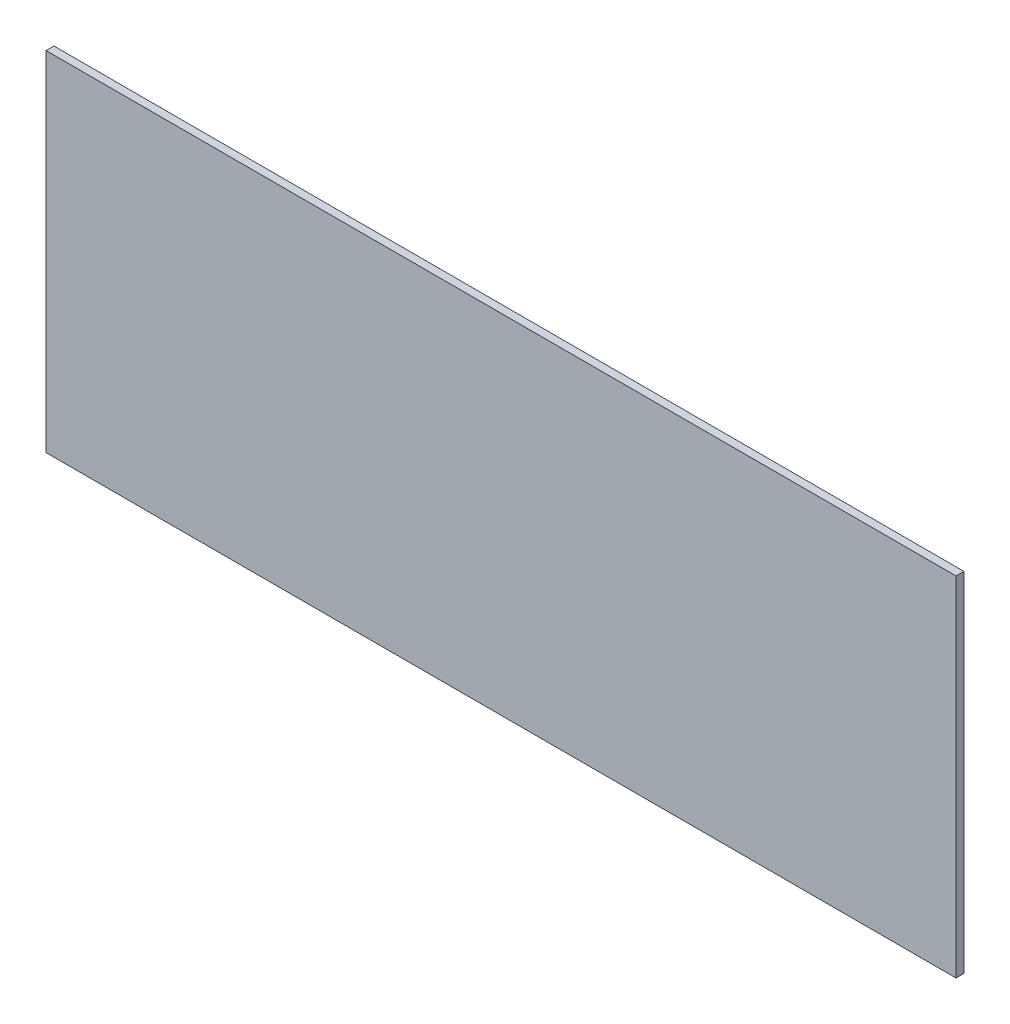
ISO-10303-21;
HEADER;
FILE_DESCRIPTION(('STEP AP214'),'2;1');
FILE_NAME('part.step','',(''),(''),'','','');
FILE_SCHEMA(('AUTOMOTIVE_DESIGN { 1 0 10303 214 1 1 1 1 }'));
ENDSEC;
DATA;
#1=APPLICATION_CONTEXT('core data for automotive mechanical design processes');
#2=APPLICATION_PROTOCOL_DEFINITION('international standard','automotive_design',2000,#1);
#3=PRODUCT_CONTEXT('',#1,'mechanical');
#4=PRODUCT('Part','Part','',(#3));
#5=PRODUCT_RELATED_PRODUCT_CATEGORY('part','',(#4));
#6=PRODUCT_DEFINITION_FORMATION('','',#4);
#7=PRODUCT_DEFINITION_CONTEXT('part definition',#1,'design');
#8=PRODUCT_DEFINITION('design','',#6,#7);
#9=PRODUCT_DEFINITION_SHAPE('','',#8);
#10=(LENGTH_UNIT() NAMED_UNIT(*) SI_UNIT(.MILLI.,.METRE.));
#11=(NAMED_UNIT(*) PLANE_ANGLE_UNIT() SI_UNIT($,.RADIAN.));
#12=(NAMED_UNIT(*) SI_UNIT($,.STERADIAN.) SOLID_ANGLE_UNIT());
#13=UNCERTAINTY_MEASURE_WITH_UNIT(LENGTH_MEASURE(1.E-05),#10,'distance_accuracy_value','');
#14=(GEOMETRIC_REPRESENTATION_CONTEXT(3) GLOBAL_UNCERTAINTY_ASSIGNED_CONTEXT((#13)) GLOBAL_UNIT_ASSIGNED_CONTEXT((#10,
#11,#12)) REPRESENTATION_CONTEXT('',''));
#15=CARTESIAN_POINT('',(0.,0.,0.));
#16=DIRECTION('',(0.,0.,1.));
#17=DIRECTION('',(1.,0.,0.));
#18=AXIS2_PLACEMENT_3D('',#15,#16,#17);
#19=CARTESIAN_POINT('',(575.,220.,10.));
#20=DIRECTION('',(-1.,0.,0.));
#21=DIRECTION('',(0.,-1.,0.));
#22=AXIS2_PLACEMENT_3D('',#19,#20,#21);
#23=PLANE('',#22);
#24=DIRECTION('',(0.,1.,0.));
#25=VECTOR('',#24,1.);
#26=CARTESIAN_POINT('',(575.,220.,0.));
#27=LINE('',#26,#25);
#28=CARTESIAN_POINT('',(575.,-220.,0.));
#29=VERTEX_POINT('',#28);
#30=CARTESIAN_POINT('',(575.,220.,0.));
#31=VERTEX_POINT('',#30);
#32=EDGE_CURVE('E96',#29,#31,#27,.T.);
#33=ORIENTED_EDGE('',*,*,#32,.T.);
#34=DIRECTION('',(0.,0.,-1.));
#35=VECTOR('',#34,1.);
#36=CARTESIAN_POINT('',(575.,220.,10.));
#37=LINE('',#36,#35);
#38=CARTESIAN_POINT('',(575.,220.,10.));
#39=VERTEX_POINT('',#38);
#40=EDGE_CURVE('E11',#39,#31,#37,.T.);
#41=ORIENTED_EDGE('',*,*,#40,.F.);
#42=DIRECTION('',(0.,1.,0.));
#43=VECTOR('',#42,1.);
#44=CARTESIAN_POINT('',(575.,220.,10.));
#45=LINE('',#44,#43);
#46=CARTESIAN_POINT('',(575.,-220.,10.));
#47=VERTEX_POINT('',#46);
#48=EDGE_CURVE('E84',#47,#39,#45,.T.);
#49=ORIENTED_EDGE('',*,*,#48,.F.);
#50=DIRECTION('',(0.,0.,-1.));
#51=VECTOR('',#50,1.);
#52=CARTESIAN_POINT('',(575.,-220.,10.));
#53=LINE('',#52,#51);
#54=EDGE_CURVE('E92',#47,#29,#53,.T.);
#55=ORIENTED_EDGE('',*,*,#54,.T.);
#56=EDGE_LOOP('',(#33,#41,#49,#55));
#57=FACE_BOUND('',#56,.T.);
#58=ADVANCED_FACE('F33',(#57),#23,.F.);
#59=CARTESIAN_POINT('',(-575.,220.,10.));
#60=DIRECTION('',(0.,-1.,0.));
#61=DIRECTION('',(0.,0.,-1.));
#62=AXIS2_PLACEMENT_3D('',#59,#60,#61);
#63=PLANE('',#62);
#64=DIRECTION('',(-1.,0.,0.));
#65=VECTOR('',#64,1.);
#66=CARTESIAN_POINT('',(-575.,220.,0.));
#67=LINE('',#66,#65);
#68=CARTESIAN_POINT('',(-575.,220.,0.));
#69=VERTEX_POINT('',#68);
#70=EDGE_CURVE('E88',#31,#69,#67,.T.);
#71=ORIENTED_EDGE('',*,*,#70,.T.);
#72=DIRECTION('',(0.,0.,-1.));
#73=VECTOR('',#72,1.);
#74=CARTESIAN_POINT('',(-575.,220.,10.));
#75=LINE('',#74,#73);
#76=CARTESIAN_POINT('',(-575.,220.,10.));
#77=VERTEX_POINT('',#76);
#78=EDGE_CURVE('E41',#77,#69,#75,.T.);
#79=ORIENTED_EDGE('',*,*,#78,.F.);
#80=DIRECTION('',(-1.,0.,0.));
#81=VECTOR('',#80,1.);
#82=CARTESIAN_POINT('',(-575.,220.,10.));
#83=LINE('',#82,#81);
#84=EDGE_CURVE('E79',#39,#77,#83,.T.);
#85=ORIENTED_EDGE('',*,*,#84,.F.);
#86=ORIENTED_EDGE('',*,*,#40,.T.);
#87=EDGE_LOOP('',(#71,#79,#85,#86));
#88=FACE_BOUND('',#87,.T.);
#89=ADVANCED_FACE('F87',(#88),#63,.F.);
#90=CARTESIAN_POINT('',(-575.,220.,10.));
#91=DIRECTION('',(1.,0.,0.));
#92=DIRECTION('',(0.,1.,0.));
#93=AXIS2_PLACEMENT_3D('',#90,#91,#92);
#94=PLANE('',#93);
#95=DIRECTION('',(0.,-1.,0.));
#96=VECTOR('',#95,1.);
#97=CARTESIAN_POINT('',(-575.,220.,0.));
#98=LINE('',#97,#96);
#99=CARTESIAN_POINT('',(-575.,-220.,0.));
#100=VERTEX_POINT('',#99);
#101=EDGE_CURVE('E66',#69,#100,#98,.T.);
#102=ORIENTED_EDGE('',*,*,#101,.T.);
#103=DIRECTION('',(0.,0.,-1.));
#104=VECTOR('',#103,1.);
#105=CARTESIAN_POINT('',(-575.,-220.,10.));
#106=LINE('',#105,#104);
#107=CARTESIAN_POINT('',(-575.,-220.,10.));
#108=VERTEX_POINT('',#107);
#109=EDGE_CURVE('E89',#108,#100,#106,.T.);
#110=ORIENTED_EDGE('',*,*,#109,.F.);
#111=DIRECTION('',(0.,-1.,0.));
#112=VECTOR('',#111,1.);
#113=CARTESIAN_POINT('',(-575.,220.,10.));
#114=LINE('',#113,#112);
#115=EDGE_CURVE('E82',#77,#108,#114,.T.);
#116=ORIENTED_EDGE('',*,*,#115,.F.);
#117=ORIENTED_EDGE('',*,*,#78,.T.);
#118=EDGE_LOOP('',(#102,#110,#116,#117));
#119=FACE_BOUND('',#118,.T.);
#120=ADVANCED_FACE('F90',(#119),#94,.F.);
#121=CARTESIAN_POINT('',(-575.,-220.,10.));
#122=DIRECTION('',(0.,1.,0.));
#123=DIRECTION('',(-1.,0.,0.));
#124=AXIS2_PLACEMENT_3D('',#121,#122,#123);
#125=PLANE('',#124);
#126=DIRECTION('',(1.,0.,0.));
#127=VECTOR('',#126,1.);
#128=CARTESIAN_POINT('',(-575.,-220.,0.));
#129=LINE('',#128,#127);
#130=EDGE_CURVE('E72',#100,#29,#129,.T.);
#131=ORIENTED_EDGE('',*,*,#130,.T.);
#132=ORIENTED_EDGE('',*,*,#54,.F.);
#133=DIRECTION('',(1.,0.,0.));
#134=VECTOR('',#133,1.);
#135=CARTESIAN_POINT('',(-575.,-220.,10.));
#136=LINE('',#135,#134);
#137=EDGE_CURVE('E49',#108,#47,#136,.T.);
#138=ORIENTED_EDGE('',*,*,#137,.F.);
#139=ORIENTED_EDGE('',*,*,#109,.T.);
#140=EDGE_LOOP('',(#131,#132,#138,#139));
#141=FACE_BOUND('',#140,.T.);
#142=ADVANCED_FACE('F103',(#141),#125,.F.);
#143=CARTESIAN_POINT('',(0.,0.,10.));
#144=DIRECTION('',(0.,0.,1.));
#145=DIRECTION('',(1.,0.,0.));
#146=AXIS2_PLACEMENT_3D('',#143,#144,#145);
#147=PLANE('',#146);
#148=ORIENTED_EDGE('',*,*,#48,.T.);
#149=ORIENTED_EDGE('',*,*,#84,.T.);
#150=ORIENTED_EDGE('',*,*,#115,.T.);
#151=ORIENTED_EDGE('',*,*,#137,.T.);
#152=EDGE_LOOP('',(#148,#149,#150,#151));
#153=FACE_BOUND('',#152,.T.);
#154=ADVANCED_FACE('F80',(#153),#147,.T.);
#155=CARTESIAN_POINT('',(0.,0.,0.));
#156=DIRECTION('',(0.,0.,1.));
#157=DIRECTION('',(1.,0.,0.));
#158=AXIS2_PLACEMENT_3D('',#155,#156,#157);
#159=PLANE('',#158);
#160=ORIENTED_EDGE('',*,*,#32,.F.);
#161=ORIENTED_EDGE('',*,*,#130,.F.);
#162=ORIENTED_EDGE('',*,*,#101,.F.);
#163=ORIENTED_EDGE('',*,*,#70,.F.);
#164=EDGE_LOOP('',(#160,#161,#162,#163));
#165=FACE_BOUND('',#164,.T.);
#166=ADVANCED_FACE('F106',(#165),#159,.F.);
#167=CLOSED_SHELL('',(#58,#89,#120,#142,#154,#166));
#168=MANIFOLD_SOLID_BREP('B2',#167);
#169=ADVANCED_BREP_SHAPE_REPRESENTATION('',(#18,#168),#14);
#170=SHAPE_DEFINITION_REPRESENTATION(#9,#169);
ENDSEC;
END-ISO-10303-21;
